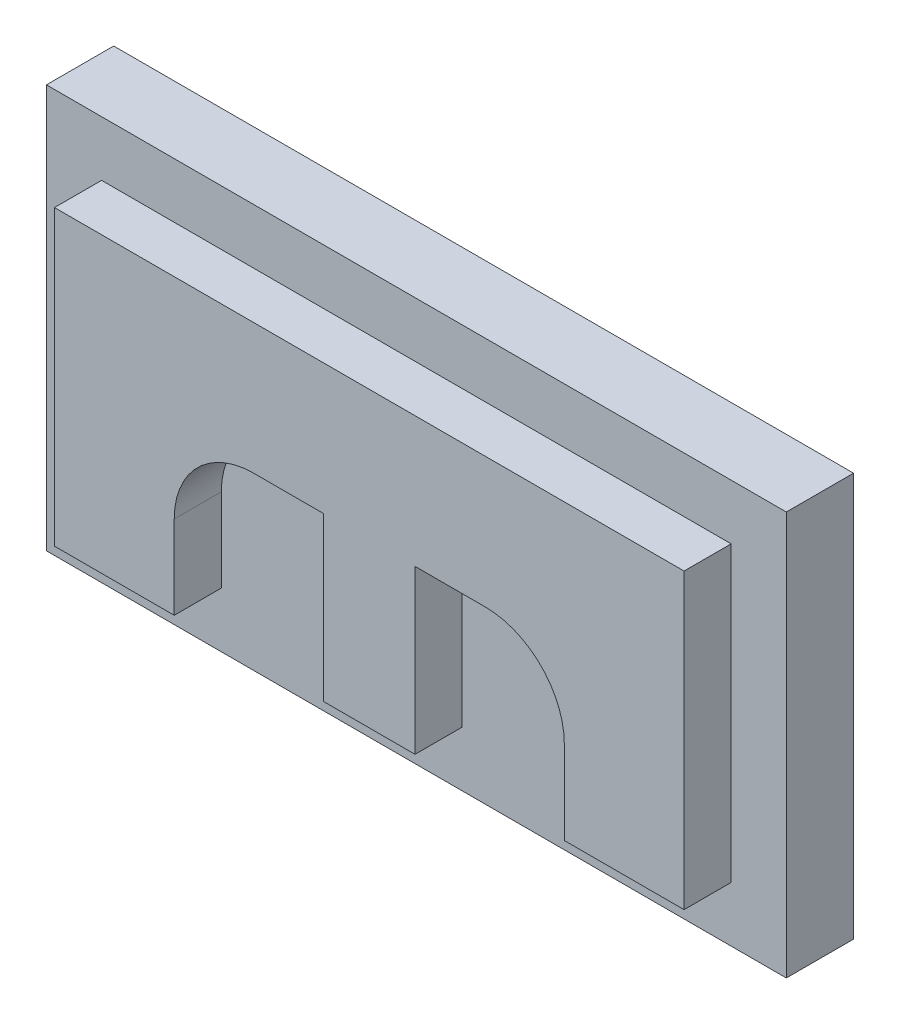
ISO-10303-21;
HEADER;
FILE_DESCRIPTION(('STEP AP214'),'2;1');
FILE_NAME('part.step','',(''),(''),'','','');
FILE_SCHEMA(('AUTOMOTIVE_DESIGN { 1 0 10303 214 1 1 1 1 }'));
ENDSEC;
DATA;
#1=APPLICATION_CONTEXT('core data for automotive mechanical design processes');
#2=APPLICATION_PROTOCOL_DEFINITION('international standard','automotive_design',2000,#1);
#3=PRODUCT_CONTEXT('',#1,'mechanical');
#4=PRODUCT('Part','Part','',(#3));
#5=PRODUCT_RELATED_PRODUCT_CATEGORY('part','',(#4));
#6=PRODUCT_DEFINITION_FORMATION('','',#4);
#7=PRODUCT_DEFINITION_CONTEXT('part definition',#1,'design');
#8=PRODUCT_DEFINITION('design','',#6,#7);
#9=PRODUCT_DEFINITION_SHAPE('','',#8);
#10=(LENGTH_UNIT() NAMED_UNIT(*) SI_UNIT(.MILLI.,.METRE.));
#11=(NAMED_UNIT(*) PLANE_ANGLE_UNIT() SI_UNIT($,.RADIAN.));
#12=(NAMED_UNIT(*) SI_UNIT($,.STERADIAN.) SOLID_ANGLE_UNIT());
#13=UNCERTAINTY_MEASURE_WITH_UNIT(LENGTH_MEASURE(1.E-05),#10,'distance_accuracy_value','');
#14=(GEOMETRIC_REPRESENTATION_CONTEXT(3) GLOBAL_UNCERTAINTY_ASSIGNED_CONTEXT((#13)) GLOBAL_UNIT_ASSIGNED_CONTEXT((#10,
#11,#12)) REPRESENTATION_CONTEXT('',''));
#15=CARTESIAN_POINT('',(0.,0.,0.));
#16=DIRECTION('',(0.,0.,1.));
#17=DIRECTION('',(1.,0.,0.));
#18=AXIS2_PLACEMENT_3D('',#15,#16,#17);
#19=CARTESIAN_POINT('',(8.2,8.2,17.));
#20=DIRECTION('',(0.,1.,0.));
#21=DIRECTION('',(0.,0.,1.));
#22=AXIS2_PLACEMENT_3D('',#19,#20,#21);
#23=PLANE('',#22);
#24=DIRECTION('',(0.,0.,1.));
#25=VECTOR('',#24,1.);
#26=CARTESIAN_POINT('',(84.,8.2,10.));
#27=LINE('',#26,#25);
#28=CARTESIAN_POINT('',(84.,8.2,10.));
#29=VERTEX_POINT('',#28);
#30=CARTESIAN_POINT('',(84.,8.2,17.));
#31=VERTEX_POINT('',#30);
#32=EDGE_CURVE('E209',#29,#31,#27,.T.);
#33=ORIENTED_EDGE('',*,*,#32,.F.);
#34=DIRECTION('',(1.,0.,0.));
#35=VECTOR('',#34,1.);
#36=CARTESIAN_POINT('',(8.2,8.2,10.));
#37=LINE('',#36,#35);
#38=CARTESIAN_POINT('',(101.8,8.2,10.));
#39=VERTEX_POINT('',#38);
#40=EDGE_CURVE('E269',#29,#39,#37,.T.);
#41=ORIENTED_EDGE('',*,*,#40,.T.);
#42=DIRECTION('',(0.,0.,-1.));
#43=VECTOR('',#42,1.);
#44=CARTESIAN_POINT('',(101.8,8.2,17.));
#45=LINE('',#44,#43);
#46=CARTESIAN_POINT('',(101.8,8.2,17.));
#47=VERTEX_POINT('',#46);
#48=EDGE_CURVE('E289',#47,#39,#45,.T.);
#49=ORIENTED_EDGE('',*,*,#48,.F.);
#50=DIRECTION('',(1.,0.,0.));
#51=VECTOR('',#50,1.);
#52=CARTESIAN_POINT('',(8.2,8.2,17.));
#53=LINE('',#52,#51);
#54=EDGE_CURVE('E252',#31,#47,#53,.T.);
#55=ORIENTED_EDGE('',*,*,#54,.F.);
#56=EDGE_LOOP('',(#33,#41,#49,#55));
#57=FACE_BOUND('',#56,.T.);
#58=ADVANCED_FACE('F47',(#57),#23,.F.);
#59=DIRECTION('',(0.,0.,1.));
#60=VECTOR('',#59,1.);
#61=CARTESIAN_POINT('',(61.8,8.2,10.));
#62=LINE('',#61,#60);
#63=CARTESIAN_POINT('',(61.8,8.2,10.));
#64=VERTEX_POINT('',#63);
#65=CARTESIAN_POINT('',(61.8,8.2,17.));
#66=VERTEX_POINT('',#65);
#67=EDGE_CURVE('E176',#64,#66,#62,.T.);
#68=ORIENTED_EDGE('',*,*,#67,.T.);
#69=CARTESIAN_POINT('',(48.2,8.2,17.));
#70=VERTEX_POINT('',#69);
#71=EDGE_CURVE('E259',#70,#66,#53,.T.);
#72=ORIENTED_EDGE('',*,*,#71,.F.);
#73=DIRECTION('',(0.,0.,1.));
#74=VECTOR('',#73,1.);
#75=CARTESIAN_POINT('',(48.2,8.2,10.));
#76=LINE('',#75,#74);
#77=CARTESIAN_POINT('',(48.2,8.2,10.));
#78=VERTEX_POINT('',#77);
#79=EDGE_CURVE('E242',#78,#70,#76,.T.);
#80=ORIENTED_EDGE('',*,*,#79,.F.);
#81=EDGE_CURVE('E275',#78,#64,#37,.T.);
#82=ORIENTED_EDGE('',*,*,#81,.T.);
#83=EDGE_LOOP('',(#68,#72,#80,#82));
#84=FACE_BOUND('',#83,.T.);
#85=ADVANCED_FACE('F380',(#84),#23,.F.);
#86=CARTESIAN_POINT('',(0.,0.,17.));
#87=DIRECTION('',(0.,0.,1.));
#88=DIRECTION('',(1.,0.,0.));
#89=AXIS2_PLACEMENT_3D('',#86,#87,#88);
#90=PLANE('',#89);
#91=DIRECTION('',(1.,0.,0.));
#92=VECTOR('',#91,1.);
#93=CARTESIAN_POINT('',(84.,32.4,17.));
#94=LINE('',#93,#92);
#95=CARTESIAN_POINT('',(61.8,32.4,17.));
#96=VERTEX_POINT('',#95);
#97=CARTESIAN_POINT('',(72.2,32.4,17.));
#98=VERTEX_POINT('',#97);
#99=EDGE_CURVE('E189',#96,#98,#94,.T.);
#100=ORIENTED_EDGE('',*,*,#99,.T.);
#101=CARTESIAN_POINT('',(72.2,20.6,17.));
#102=DIRECTION('',(0.,0.,1.));
#103=DIRECTION('',(1.,0.,0.));
#104=AXIS2_PLACEMENT_3D('',#101,#102,#103);
#105=CIRCLE('',#104,11.8);
#106=CARTESIAN_POINT('',(84.,20.6,17.));
#107=VERTEX_POINT('',#106);
#108=EDGE_CURVE('E11',#98,#107,#105,.F.);
#109=ORIENTED_EDGE('',*,*,#108,.T.);
#110=DIRECTION('',(0.,-1.,0.));
#111=VECTOR('',#110,1.);
#112=CARTESIAN_POINT('',(84.,32.4,17.));
#113=LINE('',#112,#111);
#114=EDGE_CURVE('E202',#107,#31,#113,.T.);
#115=ORIENTED_EDGE('',*,*,#114,.T.);
#116=ORIENTED_EDGE('',*,*,#54,.T.);
#117=DIRECTION('',(0.,1.,0.));
#118=VECTOR('',#117,1.);
#119=CARTESIAN_POINT('',(101.8,51.8,17.));
#120=LINE('',#119,#118);
#121=CARTESIAN_POINT('',(101.8,51.8,17.));
#122=VERTEX_POINT('',#121);
#123=EDGE_CURVE('E258',#47,#122,#120,.T.);
#124=ORIENTED_EDGE('',*,*,#123,.T.);
#125=DIRECTION('',(-1.,0.,0.));
#126=VECTOR('',#125,1.);
#127=CARTESIAN_POINT('',(8.2,51.8,17.));
#128=LINE('',#127,#126);
#129=CARTESIAN_POINT('',(8.2,51.8,17.));
#130=VERTEX_POINT('',#129);
#131=EDGE_CURVE('E262',#122,#130,#128,.T.);
#132=ORIENTED_EDGE('',*,*,#131,.T.);
#133=DIRECTION('',(0.,-1.,0.));
#134=VECTOR('',#133,1.);
#135=CARTESIAN_POINT('',(8.2,51.8,17.));
#136=LINE('',#135,#134);
#137=CARTESIAN_POINT('',(8.2,8.2,17.));
#138=VERTEX_POINT('',#137);
#139=EDGE_CURVE('E248',#130,#138,#136,.T.);
#140=ORIENTED_EDGE('',*,*,#139,.T.);
#141=CARTESIAN_POINT('',(26.,8.2,17.));
#142=VERTEX_POINT('',#141);
#143=EDGE_CURVE('E254',#138,#142,#53,.T.);
#144=ORIENTED_EDGE('',*,*,#143,.T.);
#145=DIRECTION('',(0.,-1.,0.));
#146=VECTOR('',#145,1.);
#147=CARTESIAN_POINT('',(26.,32.4,17.));
#148=LINE('',#147,#146);
#149=CARTESIAN_POINT('',(26.,20.6,17.));
#150=VERTEX_POINT('',#149);
#151=EDGE_CURVE('E213',#150,#142,#148,.T.);
#152=ORIENTED_EDGE('',*,*,#151,.F.);
#153=CARTESIAN_POINT('',(37.8,20.6,17.));
#154=DIRECTION('',(0.,0.,1.));
#155=DIRECTION('',(1.,0.,0.));
#156=AXIS2_PLACEMENT_3D('',#153,#154,#155);
#157=CIRCLE('',#156,11.8);
#158=CARTESIAN_POINT('',(37.8,32.4,17.));
#159=VERTEX_POINT('',#158);
#160=EDGE_CURVE('E349',#150,#159,#157,.F.);
#161=ORIENTED_EDGE('',*,*,#160,.T.);
#162=DIRECTION('',(-1.,0.,0.));
#163=VECTOR('',#162,1.);
#164=CARTESIAN_POINT('',(26.,32.4,17.));
#165=LINE('',#164,#163);
#166=CARTESIAN_POINT('',(48.2,32.4,17.));
#167=VERTEX_POINT('',#166);
#168=EDGE_CURVE('E220',#167,#159,#165,.T.);
#169=ORIENTED_EDGE('',*,*,#168,.F.);
#170=DIRECTION('',(0.,1.,0.));
#171=VECTOR('',#170,1.);
#172=CARTESIAN_POINT('',(48.2,32.4,17.));
#173=LINE('',#172,#171);
#174=EDGE_CURVE('E231',#70,#167,#173,.T.);
#175=ORIENTED_EDGE('',*,*,#174,.F.);
#176=ORIENTED_EDGE('',*,*,#71,.T.);
#177=DIRECTION('',(0.,1.,0.));
#178=VECTOR('',#177,1.);
#179=CARTESIAN_POINT('',(61.8,32.4,17.));
#180=LINE('',#179,#178);
#181=EDGE_CURVE('E199',#66,#96,#180,.T.);
#182=ORIENTED_EDGE('',*,*,#181,.T.);
#183=EDGE_LOOP('',(#100,#109,#115,#116,#124,#132,#140,#144,#152,#161,#169,#175,#176,#182));
#184=FACE_BOUND('',#183,.T.);
#185=ADVANCED_FACE('F373',(#184),#90,.T.);
#186=CARTESIAN_POINT('',(8.2,8.2,10.));
#187=VERTEX_POINT('',#186);
#188=CARTESIAN_POINT('',(26.,8.2,10.));
#189=VERTEX_POINT('',#188);
#190=EDGE_CURVE('E270',#187,#189,#37,.T.);
#191=ORIENTED_EDGE('',*,*,#190,.T.);
#192=DIRECTION('',(0.,0.,1.));
#193=VECTOR('',#192,1.);
#194=CARTESIAN_POINT('',(26.,8.2,10.));
#195=LINE('',#194,#193);
#196=EDGE_CURVE('E228',#189,#142,#195,.T.);
#197=ORIENTED_EDGE('',*,*,#196,.T.);
#198=ORIENTED_EDGE('',*,*,#143,.F.);
#199=DIRECTION('',(0.,0.,-1.));
#200=VECTOR('',#199,1.);
#201=CARTESIAN_POINT('',(8.2,8.2,17.));
#202=LINE('',#201,#200);
#203=EDGE_CURVE('E293',#138,#187,#202,.T.);
#204=ORIENTED_EDGE('',*,*,#203,.T.);
#205=EDGE_LOOP('',(#191,#197,#198,#204));
#206=FACE_BOUND('',#205,.T.);
#207=ADVANCED_FACE('F398',(#206),#23,.F.);
#208=CARTESIAN_POINT('',(0.,0.,10.));
#209=DIRECTION('',(0.,0.,-1.));
#210=DIRECTION('',(-1.,0.,0.));
#211=AXIS2_PLACEMENT_3D('',#208,#209,#210);
#212=PLANE('',#211);
#213=DIRECTION('',(0.,-1.,0.));
#214=VECTOR('',#213,1.);
#215=CARTESIAN_POINT('',(0.,0.,10.));
#216=LINE('',#215,#214);
#217=CARTESIAN_POINT('',(0.,60.,10.));
#218=VERTEX_POINT('',#217);
#219=CARTESIAN_POINT('',(0.,0.,10.));
#220=VERTEX_POINT('',#219);
#221=EDGE_CURVE('E298',#218,#220,#216,.T.);
#222=ORIENTED_EDGE('',*,*,#221,.T.);
#223=DIRECTION('',(1.,0.,0.));
#224=VECTOR('',#223,1.);
#225=CARTESIAN_POINT('',(0.,0.,10.));
#226=LINE('',#225,#224);
#227=CARTESIAN_POINT('',(110.,0.,10.));
#228=VERTEX_POINT('',#227);
#229=EDGE_CURVE('E302',#220,#228,#226,.T.);
#230=ORIENTED_EDGE('',*,*,#229,.T.);
#231=DIRECTION('',(0.,1.,0.));
#232=VECTOR('',#231,1.);
#233=CARTESIAN_POINT('',(110.,0.,10.));
#234=LINE('',#233,#232);
#235=CARTESIAN_POINT('',(110.,60.,10.));
#236=VERTEX_POINT('',#235);
#237=EDGE_CURVE('E306',#228,#236,#234,.T.);
#238=ORIENTED_EDGE('',*,*,#237,.T.);
#239=DIRECTION('',(-1.,0.,0.));
#240=VECTOR('',#239,1.);
#241=CARTESIAN_POINT('',(0.,60.,10.));
#242=LINE('',#241,#240);
#243=EDGE_CURVE('E309',#236,#218,#242,.T.);
#244=ORIENTED_EDGE('',*,*,#243,.T.);
#245=EDGE_LOOP('',(#222,#230,#238,#244));
#246=FACE_BOUND('',#245,.T.);
#247=DIRECTION('',(0.,-1.,0.));
#248=VECTOR('',#247,1.);
#249=CARTESIAN_POINT('',(84.,32.4,10.));
#250=LINE('',#249,#248);
#251=CARTESIAN_POINT('',(84.,20.6,10.));
#252=VERTEX_POINT('',#251);
#253=EDGE_CURVE('E196',#252,#29,#250,.T.);
#254=ORIENTED_EDGE('',*,*,#253,.F.);
#255=CARTESIAN_POINT('',(72.2,20.6,10.));
#256=DIRECTION('',(0.,0.,-1.));
#257=DIRECTION('',(-1.,0.,0.));
#258=AXIS2_PLACEMENT_3D('',#255,#256,#257);
#259=CIRCLE('',#258,11.8);
#260=CARTESIAN_POINT('',(72.2,32.4,10.));
#261=VERTEX_POINT('',#260);
#262=EDGE_CURVE('E56',#252,#261,#259,.F.);
#263=ORIENTED_EDGE('',*,*,#262,.T.);
#264=DIRECTION('',(1.,0.,0.));
#265=VECTOR('',#264,1.);
#266=CARTESIAN_POINT('',(84.,32.4,10.));
#267=LINE('',#266,#265);
#268=CARTESIAN_POINT('',(61.8,32.4,10.));
#269=VERTEX_POINT('',#268);
#270=EDGE_CURVE('E182',#269,#261,#267,.T.);
#271=ORIENTED_EDGE('',*,*,#270,.F.);
#272=DIRECTION('',(0.,1.,0.));
#273=VECTOR('',#272,1.);
#274=CARTESIAN_POINT('',(61.8,32.4,10.));
#275=LINE('',#274,#273);
#276=EDGE_CURVE('E170',#64,#269,#275,.T.);
#277=ORIENTED_EDGE('',*,*,#276,.F.);
#278=ORIENTED_EDGE('',*,*,#81,.F.);
#279=DIRECTION('',(0.,1.,0.));
#280=VECTOR('',#279,1.);
#281=CARTESIAN_POINT('',(48.2,32.4,10.));
#282=LINE('',#281,#280);
#283=CARTESIAN_POINT('',(48.2,32.4,10.));
#284=VERTEX_POINT('',#283);
#285=EDGE_CURVE('E219',#78,#284,#282,.T.);
#286=ORIENTED_EDGE('',*,*,#285,.T.);
#287=DIRECTION('',(-1.,0.,0.));
#288=VECTOR('',#287,1.);
#289=CARTESIAN_POINT('',(26.,32.4,10.));
#290=LINE('',#289,#288);
#291=CARTESIAN_POINT('',(37.8,32.4,10.));
#292=VERTEX_POINT('',#291);
#293=EDGE_CURVE('E224',#284,#292,#290,.T.);
#294=ORIENTED_EDGE('',*,*,#293,.T.);
#295=CARTESIAN_POINT('',(37.8,20.6,10.));
#296=DIRECTION('',(0.,0.,-1.));
#297=DIRECTION('',(-1.,0.,0.));
#298=AXIS2_PLACEMENT_3D('',#295,#296,#297);
#299=CIRCLE('',#298,11.8);
#300=CARTESIAN_POINT('',(26.,20.6,10.));
#301=VERTEX_POINT('',#300);
#302=EDGE_CURVE('E346',#292,#301,#299,.F.);
#303=ORIENTED_EDGE('',*,*,#302,.T.);
#304=DIRECTION('',(0.,-1.,0.));
#305=VECTOR('',#304,1.);
#306=CARTESIAN_POINT('',(26.,32.4,10.));
#307=LINE('',#306,#305);
#308=EDGE_CURVE('E216',#301,#189,#307,.T.);
#309=ORIENTED_EDGE('',*,*,#308,.T.);
#310=ORIENTED_EDGE('',*,*,#190,.F.);
#311=DIRECTION('',(0.,-1.,0.));
#312=VECTOR('',#311,1.);
#313=CARTESIAN_POINT('',(8.2,51.8,10.));
#314=LINE('',#313,#312);
#315=CARTESIAN_POINT('',(8.2,51.8,10.));
#316=VERTEX_POINT('',#315);
#317=EDGE_CURVE('E241',#316,#187,#314,.T.);
#318=ORIENTED_EDGE('',*,*,#317,.F.);
#319=DIRECTION('',(-1.,0.,0.));
#320=VECTOR('',#319,1.);
#321=CARTESIAN_POINT('',(8.2,51.8,10.));
#322=LINE('',#321,#320);
#323=CARTESIAN_POINT('',(101.8,51.8,10.));
#324=VERTEX_POINT('',#323);
#325=EDGE_CURVE('E253',#324,#316,#322,.T.);
#326=ORIENTED_EDGE('',*,*,#325,.F.);
#327=DIRECTION('',(0.,1.,0.));
#328=VECTOR('',#327,1.);
#329=CARTESIAN_POINT('',(101.8,51.8,10.));
#330=LINE('',#329,#328);
#331=EDGE_CURVE('E274',#39,#324,#330,.T.);
#332=ORIENTED_EDGE('',*,*,#331,.F.);
#333=ORIENTED_EDGE('',*,*,#40,.F.);
#334=EDGE_LOOP('',(#254,#263,#271,#277,#278,#286,#294,#303,#309,#310,#318,#326,#332,#333));
#335=FACE_BOUND('',#334,.T.);
#336=ADVANCED_FACE('F193',(#246,#335),#212,.F.);
#337=CARTESIAN_POINT('',(0.,0.,10.));
#338=DIRECTION('',(1.,0.,0.));
#339=DIRECTION('',(0.,0.,-1.));
#340=AXIS2_PLACEMENT_3D('',#337,#338,#339);
#341=PLANE('',#340);
#342=DIRECTION('',(0.,-1.,0.));
#343=VECTOR('',#342,1.);
#344=CARTESIAN_POINT('',(0.,0.,0.));
#345=LINE('',#344,#343);
#346=CARTESIAN_POINT('',(0.,60.,0.));
#347=VERTEX_POINT('',#346);
#348=CARTESIAN_POINT('',(0.,0.,0.));
#349=VERTEX_POINT('',#348);
#350=EDGE_CURVE('E297',#347,#349,#345,.T.);
#351=ORIENTED_EDGE('',*,*,#350,.T.);
#352=DIRECTION('',(0.,0.,-1.));
#353=VECTOR('',#352,1.);
#354=CARTESIAN_POINT('',(0.,0.,10.));
#355=LINE('',#354,#353);
#356=EDGE_CURVE('E335',#220,#349,#355,.T.);
#357=ORIENTED_EDGE('',*,*,#356,.F.);
#358=ORIENTED_EDGE('',*,*,#221,.F.);
#359=DIRECTION('',(0.,0.,-1.));
#360=VECTOR('',#359,1.);
#361=CARTESIAN_POINT('',(0.,60.,10.));
#362=LINE('',#361,#360);
#363=EDGE_CURVE('E312',#218,#347,#362,.T.);
#364=ORIENTED_EDGE('',*,*,#363,.T.);
#365=EDGE_LOOP('',(#351,#357,#358,#364));
#366=FACE_BOUND('',#365,.T.);
#367=ADVANCED_FACE('F427',(#366),#341,.F.);
#368=CARTESIAN_POINT('',(0.,0.,10.));
#369=DIRECTION('',(0.,1.,0.));
#370=DIRECTION('',(0.,0.,1.));
#371=AXIS2_PLACEMENT_3D('',#368,#369,#370);
#372=PLANE('',#371);
#373=DIRECTION('',(1.,0.,0.));
#374=VECTOR('',#373,1.);
#375=CARTESIAN_POINT('',(0.,0.,0.));
#376=LINE('',#375,#374);
#377=CARTESIAN_POINT('',(110.,0.,0.));
#378=VERTEX_POINT('',#377);
#379=EDGE_CURVE('E316',#349,#378,#376,.T.);
#380=ORIENTED_EDGE('',*,*,#379,.T.);
#381=DIRECTION('',(0.,0.,-1.));
#382=VECTOR('',#381,1.);
#383=CARTESIAN_POINT('',(110.,0.,10.));
#384=LINE('',#383,#382);
#385=EDGE_CURVE('E331',#228,#378,#384,.T.);
#386=ORIENTED_EDGE('',*,*,#385,.F.);
#387=ORIENTED_EDGE('',*,*,#229,.F.);
#388=ORIENTED_EDGE('',*,*,#356,.T.);
#389=EDGE_LOOP('',(#380,#386,#387,#388));
#390=FACE_BOUND('',#389,.T.);
#391=ADVANCED_FACE('F453',(#390),#372,.F.);
#392=CARTESIAN_POINT('',(110.,0.,10.));
#393=DIRECTION('',(-1.,0.,0.));
#394=DIRECTION('',(0.,0.,1.));
#395=AXIS2_PLACEMENT_3D('',#392,#393,#394);
#396=PLANE('',#395);
#397=DIRECTION('',(0.,1.,0.));
#398=VECTOR('',#397,1.);
#399=CARTESIAN_POINT('',(110.,0.,0.));
#400=LINE('',#399,#398);
#401=CARTESIAN_POINT('',(110.,60.,0.));
#402=VERTEX_POINT('',#401);
#403=EDGE_CURVE('E319',#378,#402,#400,.T.);
#404=ORIENTED_EDGE('',*,*,#403,.T.);
#405=DIRECTION('',(0.,0.,-1.));
#406=VECTOR('',#405,1.);
#407=CARTESIAN_POINT('',(110.,60.,10.));
#408=LINE('',#407,#406);
#409=EDGE_CURVE('E327',#236,#402,#408,.T.);
#410=ORIENTED_EDGE('',*,*,#409,.F.);
#411=ORIENTED_EDGE('',*,*,#237,.F.);
#412=ORIENTED_EDGE('',*,*,#385,.T.);
#413=EDGE_LOOP('',(#404,#410,#411,#412));
#414=FACE_BOUND('',#413,.T.);
#415=ADVANCED_FACE('F449',(#414),#396,.F.);
#416=CARTESIAN_POINT('',(0.,60.,10.));
#417=DIRECTION('',(0.,-1.,0.));
#418=DIRECTION('',(0.,0.,-1.));
#419=AXIS2_PLACEMENT_3D('',#416,#417,#418);
#420=PLANE('',#419);
#421=DIRECTION('',(-1.,0.,0.));
#422=VECTOR('',#421,1.);
#423=CARTESIAN_POINT('',(0.,60.,0.));
#424=LINE('',#423,#422);
#425=EDGE_CURVE('E303',#402,#347,#424,.T.);
#426=ORIENTED_EDGE('',*,*,#425,.T.);
#427=ORIENTED_EDGE('',*,*,#363,.F.);
#428=ORIENTED_EDGE('',*,*,#243,.F.);
#429=ORIENTED_EDGE('',*,*,#409,.T.);
#430=EDGE_LOOP('',(#426,#427,#428,#429));
#431=FACE_BOUND('',#430,.T.);
#432=ADVANCED_FACE('F443',(#431),#420,.F.);
#433=CARTESIAN_POINT('',(0.,0.,0.));
#434=DIRECTION('',(0.,0.,-1.));
#435=DIRECTION('',(-1.,0.,0.));
#436=AXIS2_PLACEMENT_3D('',#433,#434,#435);
#437=PLANE('',#436);
#438=ORIENTED_EDGE('',*,*,#350,.F.);
#439=ORIENTED_EDGE('',*,*,#425,.F.);
#440=ORIENTED_EDGE('',*,*,#403,.F.);
#441=ORIENTED_EDGE('',*,*,#379,.F.);
#442=EDGE_LOOP('',(#438,#439,#440,#441));
#443=FACE_BOUND('',#442,.T.);
#444=ADVANCED_FACE('F439',(#443),#437,.T.);
#445=CARTESIAN_POINT('',(8.2,51.8,17.));
#446=DIRECTION('',(1.,0.,0.));
#447=DIRECTION('',(0.,1.,0.));
#448=AXIS2_PLACEMENT_3D('',#445,#446,#447);
#449=PLANE('',#448);
#450=ORIENTED_EDGE('',*,*,#317,.T.);
#451=ORIENTED_EDGE('',*,*,#203,.F.);
#452=ORIENTED_EDGE('',*,*,#139,.F.);
#453=DIRECTION('',(0.,0.,-1.));
#454=VECTOR('',#453,1.);
#455=CARTESIAN_POINT('',(8.2,51.8,17.));
#456=LINE('',#455,#454);
#457=EDGE_CURVE('E265',#130,#316,#456,.T.);
#458=ORIENTED_EDGE('',*,*,#457,.T.);
#459=EDGE_LOOP('',(#450,#451,#452,#458));
#460=FACE_BOUND('',#459,.T.);
#461=ADVANCED_FACE('F404',(#460),#449,.F.);
#462=CARTESIAN_POINT('',(101.8,51.8,17.));
#463=DIRECTION('',(-1.,0.,0.));
#464=DIRECTION('',(0.,-1.,0.));
#465=AXIS2_PLACEMENT_3D('',#462,#463,#464);
#466=PLANE('',#465);
#467=ORIENTED_EDGE('',*,*,#331,.T.);
#468=DIRECTION('',(0.,0.,-1.));
#469=VECTOR('',#468,1.);
#470=CARTESIAN_POINT('',(101.8,51.8,17.));
#471=LINE('',#470,#469);
#472=EDGE_CURVE('E285',#122,#324,#471,.T.);
#473=ORIENTED_EDGE('',*,*,#472,.F.);
#474=ORIENTED_EDGE('',*,*,#123,.F.);
#475=ORIENTED_EDGE('',*,*,#48,.T.);
#476=EDGE_LOOP('',(#467,#473,#474,#475));
#477=FACE_BOUND('',#476,.T.);
#478=ADVANCED_FACE('F371',(#477),#466,.F.);
#479=CARTESIAN_POINT('',(8.2,51.8,17.));
#480=DIRECTION('',(0.,-1.,0.));
#481=DIRECTION('',(0.,0.,-1.));
#482=AXIS2_PLACEMENT_3D('',#479,#480,#481);
#483=PLANE('',#482);
#484=ORIENTED_EDGE('',*,*,#325,.T.);
#485=ORIENTED_EDGE('',*,*,#457,.F.);
#486=ORIENTED_EDGE('',*,*,#131,.F.);
#487=ORIENTED_EDGE('',*,*,#472,.T.);
#488=EDGE_LOOP('',(#484,#485,#486,#487));
#489=FACE_BOUND('',#488,.T.);
#490=ADVANCED_FACE('F402',(#489),#483,.F.);
#491=CARTESIAN_POINT('',(26.,32.4,10.));
#492=DIRECTION('',(-1.,0.,0.));
#493=DIRECTION('',(0.,0.,1.));
#494=AXIS2_PLACEMENT_3D('',#491,#492,#493);
#495=PLANE('',#494);
#496=ORIENTED_EDGE('',*,*,#308,.F.);
#497=DIRECTION('',(0.,0.,1.));
#498=VECTOR('',#497,1.);
#499=CARTESIAN_POINT('',(26.,20.6,17.));
#500=LINE('',#499,#498);
#501=EDGE_CURVE('E339',#301,#150,#500,.T.);
#502=ORIENTED_EDGE('',*,*,#501,.T.);
#503=ORIENTED_EDGE('',*,*,#151,.T.);
#504=ORIENTED_EDGE('',*,*,#196,.F.);
#505=EDGE_LOOP('',(#496,#502,#503,#504));
#506=FACE_BOUND('',#505,.T.);
#507=ADVANCED_FACE('F395',(#506),#495,.F.);
#508=CARTESIAN_POINT('',(26.,32.4,10.));
#509=DIRECTION('',(0.,1.,0.));
#510=DIRECTION('',(0.,0.,1.));
#511=AXIS2_PLACEMENT_3D('',#508,#509,#510);
#512=PLANE('',#511);
#513=ORIENTED_EDGE('',*,*,#168,.T.);
#514=DIRECTION('',(0.,0.,1.));
#515=VECTOR('',#514,1.);
#516=CARTESIAN_POINT('',(37.8,32.4,10.));
#517=LINE('',#516,#515);
#518=EDGE_CURVE('E343',#159,#292,#517,.F.);
#519=ORIENTED_EDGE('',*,*,#518,.T.);
#520=ORIENTED_EDGE('',*,*,#293,.F.);
#521=DIRECTION('',(0.,0.,1.));
#522=VECTOR('',#521,1.);
#523=CARTESIAN_POINT('',(48.2,32.4,10.));
#524=LINE('',#523,#522);
#525=EDGE_CURVE('E238',#284,#167,#524,.T.);
#526=ORIENTED_EDGE('',*,*,#525,.T.);
#527=EDGE_LOOP('',(#513,#519,#520,#526));
#528=FACE_BOUND('',#527,.T.);
#529=ADVANCED_FACE('F386',(#528),#512,.F.);
#530=CARTESIAN_POINT('',(48.2,32.4,10.));
#531=DIRECTION('',(1.,0.,0.));
#532=DIRECTION('',(0.,0.,-1.));
#533=AXIS2_PLACEMENT_3D('',#530,#531,#532);
#534=PLANE('',#533);
#535=ORIENTED_EDGE('',*,*,#174,.T.);
#536=ORIENTED_EDGE('',*,*,#525,.F.);
#537=ORIENTED_EDGE('',*,*,#285,.F.);
#538=ORIENTED_EDGE('',*,*,#79,.T.);
#539=EDGE_LOOP('',(#535,#536,#537,#538));
#540=FACE_BOUND('',#539,.T.);
#541=ADVANCED_FACE('F405',(#540),#534,.F.);
#542=CARTESIAN_POINT('',(37.8,20.6,10.));
#543=DIRECTION('',(0.,0.,-1.));
#544=DIRECTION('',(-1.,0.,0.));
#545=AXIS2_PLACEMENT_3D('',#542,#543,#544);
#546=CYLINDRICAL_SURFACE('',#545,11.8);
#547=ORIENTED_EDGE('',*,*,#302,.F.);
#548=ORIENTED_EDGE('',*,*,#518,.F.);
#549=ORIENTED_EDGE('',*,*,#160,.F.);
#550=ORIENTED_EDGE('',*,*,#501,.F.);
#551=EDGE_LOOP('',(#547,#548,#549,#550));
#552=FACE_BOUND('',#551,.T.);
#553=ADVANCED_FACE('F390',(#552),#546,.F.);
#554=CARTESIAN_POINT('',(84.,32.4,10.));
#555=DIRECTION('',(-1.,0.,0.));
#556=DIRECTION('',(0.,0.,1.));
#557=AXIS2_PLACEMENT_3D('',#554,#555,#556);
#558=PLANE('',#557);
#559=ORIENTED_EDGE('',*,*,#114,.F.);
#560=DIRECTION('',(0.,0.,1.));
#561=VECTOR('',#560,1.);
#562=CARTESIAN_POINT('',(84.,20.6,10.));
#563=LINE('',#562,#561);
#564=EDGE_CURVE('E63',#107,#252,#563,.F.);
#565=ORIENTED_EDGE('',*,*,#564,.T.);
#566=ORIENTED_EDGE('',*,*,#253,.T.);
#567=ORIENTED_EDGE('',*,*,#32,.T.);
#568=EDGE_LOOP('',(#559,#565,#566,#567));
#569=FACE_BOUND('',#568,.T.);
#570=ADVANCED_FACE('F375',(#569),#558,.T.);
#571=CARTESIAN_POINT('',(61.8,32.4,10.));
#572=DIRECTION('',(1.,0.,0.));
#573=DIRECTION('',(0.,0.,-1.));
#574=AXIS2_PLACEMENT_3D('',#571,#572,#573);
#575=PLANE('',#574);
#576=ORIENTED_EDGE('',*,*,#181,.F.);
#577=ORIENTED_EDGE('',*,*,#67,.F.);
#578=ORIENTED_EDGE('',*,*,#276,.T.);
#579=DIRECTION('',(0.,0.,1.));
#580=VECTOR('',#579,1.);
#581=CARTESIAN_POINT('',(61.8,32.4,10.));
#582=LINE('',#581,#580);
#583=EDGE_CURVE('E173',#269,#96,#582,.T.);
#584=ORIENTED_EDGE('',*,*,#583,.T.);
#585=EDGE_LOOP('',(#576,#577,#578,#584));
#586=FACE_BOUND('',#585,.T.);
#587=ADVANCED_FACE('F172',(#586),#575,.T.);
#588=CARTESIAN_POINT('',(84.,32.4,10.));
#589=DIRECTION('',(0.,-1.,0.));
#590=DIRECTION('',(0.,0.,-1.));
#591=AXIS2_PLACEMENT_3D('',#588,#589,#590);
#592=PLANE('',#591);
#593=ORIENTED_EDGE('',*,*,#270,.T.);
#594=DIRECTION('',(0.,0.,1.));
#595=VECTOR('',#594,1.);
#596=CARTESIAN_POINT('',(72.2,32.4,17.));
#597=LINE('',#596,#595);
#598=EDGE_CURVE('E352',#261,#98,#597,.T.);
#599=ORIENTED_EDGE('',*,*,#598,.T.);
#600=ORIENTED_EDGE('',*,*,#99,.F.);
#601=ORIENTED_EDGE('',*,*,#583,.F.);
#602=EDGE_LOOP('',(#593,#599,#600,#601));
#603=FACE_BOUND('',#602,.T.);
#604=ADVANCED_FACE('F186',(#603),#592,.T.);
#605=CARTESIAN_POINT('',(72.2,20.6,10.));
#606=DIRECTION('',(0.,0.,-1.));
#607=DIRECTION('',(-1.,0.,0.));
#608=AXIS2_PLACEMENT_3D('',#605,#606,#607);
#609=CYLINDRICAL_SURFACE('',#608,11.8);
#610=ORIENTED_EDGE('',*,*,#262,.F.);
#611=ORIENTED_EDGE('',*,*,#564,.F.);
#612=ORIENTED_EDGE('',*,*,#108,.F.);
#613=ORIENTED_EDGE('',*,*,#598,.F.);
#614=EDGE_LOOP('',(#610,#611,#612,#613));
#615=FACE_BOUND('',#614,.T.);
#616=ADVANCED_FACE('F49',(#615),#609,.F.);
#617=CLOSED_SHELL('',(#58,#85,#185,#207,#336,#367,#391,#415,#432,#444,#461,#478,#490,#507,#529,
#541,#553,#570,#587,#604,#616));
#618=MANIFOLD_SOLID_BREP('B2',#617);
#619=ADVANCED_BREP_SHAPE_REPRESENTATION('',(#18,#618),#14);
#620=SHAPE_DEFINITION_REPRESENTATION(#9,#619);
ENDSEC;
END-ISO-10303-21;
